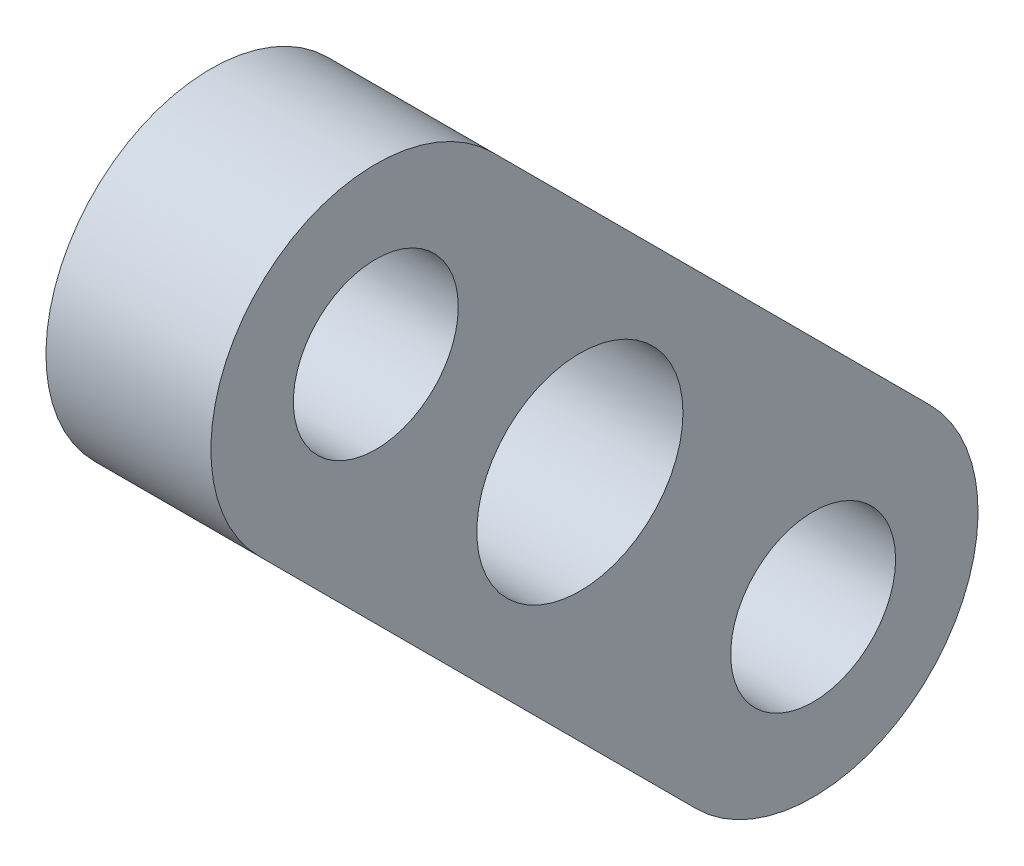
ISO-10303-21;
HEADER;
FILE_DESCRIPTION(('STEP AP214'),'2;1');
FILE_NAME('part.step','',(''),(''),'','','');
FILE_SCHEMA(('AUTOMOTIVE_DESIGN { 1 0 10303 214 1 1 1 1 }'));
ENDSEC;
DATA;
#1=APPLICATION_CONTEXT('core data for automotive mechanical design processes');
#2=APPLICATION_PROTOCOL_DEFINITION('international standard','automotive_design',2000,#1);
#3=PRODUCT_CONTEXT('',#1,'mechanical');
#4=PRODUCT('Part','Part','',(#3));
#5=PRODUCT_RELATED_PRODUCT_CATEGORY('part','',(#4));
#6=PRODUCT_DEFINITION_FORMATION('','',#4);
#7=PRODUCT_DEFINITION_CONTEXT('part definition',#1,'design');
#8=PRODUCT_DEFINITION('design','',#6,#7);
#9=PRODUCT_DEFINITION_SHAPE('','',#8);
#10=(LENGTH_UNIT() NAMED_UNIT(*) SI_UNIT(.MILLI.,.METRE.));
#11=(NAMED_UNIT(*) PLANE_ANGLE_UNIT() SI_UNIT($,.RADIAN.));
#12=(NAMED_UNIT(*) SI_UNIT($,.STERADIAN.) SOLID_ANGLE_UNIT());
#13=UNCERTAINTY_MEASURE_WITH_UNIT(LENGTH_MEASURE(1.E-05),#10,'distance_accuracy_value','');
#14=(GEOMETRIC_REPRESENTATION_CONTEXT(3) GLOBAL_UNCERTAINTY_ASSIGNED_CONTEXT((#13)) GLOBAL_UNIT_ASSIGNED_CONTEXT((#10,
#11,#12)) REPRESENTATION_CONTEXT('',''));
#15=CARTESIAN_POINT('',(0.,0.,0.));
#16=DIRECTION('',(0.,0.,1.));
#17=DIRECTION('',(1.,0.,0.));
#18=AXIS2_PLACEMENT_3D('',#15,#16,#17);
#19=CARTESIAN_POINT('',(2.,-1.41421356237309,1.4142135623731));
#20=DIRECTION('',(0.,0.707106781186544,-0.707106781186551));
#21=DIRECTION('',(0.,0.707106781186551,0.707106781186544));
#22=AXIS2_PLACEMENT_3D('',#19,#20,#21);
#23=PLANE('',#22);
#24=DIRECTION('',(0.,-0.707106781186551,-0.707106781186544));
#25=VECTOR('',#24,1.);
#26=CARTESIAN_POINT('',(0.,-1.41421356237309,1.4142135623731));
#27=LINE('',#26,#25);
#28=CARTESIAN_POINT('',(0.,1.06066017177984,3.88908729652601));
#29=VERTEX_POINT('',#28);
#30=CARTESIAN_POINT('',(0.,-4.24264068711929,-1.41421356237307));
#31=VERTEX_POINT('',#30);
#32=EDGE_CURVE('E113',#29,#31,#27,.T.);
#33=ORIENTED_EDGE('',*,*,#32,.T.);
#34=DIRECTION('',(-1.,0.,0.));
#35=VECTOR('',#34,1.);
#36=CARTESIAN_POINT('',(2.,-4.24264068711929,-1.41421356237307));
#37=LINE('',#36,#35);
#38=CARTESIAN_POINT('',(2.,-4.24264068711929,-1.41421356237307));
#39=VERTEX_POINT('',#38);
#40=EDGE_CURVE('E11',#39,#31,#37,.T.);
#41=ORIENTED_EDGE('',*,*,#40,.F.);
#42=DIRECTION('',(0.,-0.707106781186551,-0.707106781186544));
#43=VECTOR('',#42,1.);
#44=CARTESIAN_POINT('',(2.,-1.41421356237309,1.4142135623731));
#45=LINE('',#44,#43);
#46=CARTESIAN_POINT('',(2.,1.06066017177984,3.88908729652601));
#47=VERTEX_POINT('',#46);
#48=EDGE_CURVE('E89',#47,#39,#45,.T.);
#49=ORIENTED_EDGE('',*,*,#48,.F.);
#50=DIRECTION('',(-1.,0.,0.));
#51=VECTOR('',#50,1.);
#52=CARTESIAN_POINT('',(2.,1.06066017177984,3.88908729652601));
#53=LINE('',#52,#51);
#54=EDGE_CURVE('E112',#47,#29,#53,.T.);
#55=ORIENTED_EDGE('',*,*,#54,.T.);
#56=EDGE_LOOP('',(#33,#41,#49,#55));
#57=FACE_BOUND('',#56,.T.);
#58=ADVANCED_FACE('F41',(#57),#23,.F.);
#59=CARTESIAN_POINT('',(2.,-2.8284271247462,-2.82842712474617));
#60=DIRECTION('',(-1.,0.,0.));
#61=DIRECTION('',(0.,0.,1.));
#62=AXIS2_PLACEMENT_3D('',#59,#60,#61);
#63=CYLINDRICAL_SURFACE('',#62,2.);
#64=CARTESIAN_POINT('',(0.,-2.8284271247462,-2.82842712474617));
#65=DIRECTION('',(1.,0.,0.));
#66=DIRECTION('',(0.,0.,-1.));
#67=AXIS2_PLACEMENT_3D('',#64,#65,#66);
#68=CIRCLE('',#67,2.);
#69=CARTESIAN_POINT('',(0.,-1.41421356237312,-4.24264068711928));
#70=VERTEX_POINT('',#69);
#71=EDGE_CURVE('E94',#31,#70,#68,.T.);
#72=ORIENTED_EDGE('',*,*,#71,.T.);
#73=DIRECTION('',(-1.,0.,0.));
#74=VECTOR('',#73,1.);
#75=CARTESIAN_POINT('',(2.,-1.41421356237312,-4.24264068711928));
#76=LINE('',#75,#74);
#77=CARTESIAN_POINT('',(2.,-1.41421356237312,-4.24264068711928));
#78=VERTEX_POINT('',#77);
#79=EDGE_CURVE('E49',#78,#70,#76,.T.);
#80=ORIENTED_EDGE('',*,*,#79,.F.);
#81=CARTESIAN_POINT('',(2.,-2.8284271247462,-2.82842712474617));
#82=DIRECTION('',(1.,0.,0.));
#83=DIRECTION('',(0.,0.,-1.));
#84=AXIS2_PLACEMENT_3D('',#81,#82,#83);
#85=CIRCLE('',#84,2.);
#86=EDGE_CURVE('E83',#39,#78,#85,.T.);
#87=ORIENTED_EDGE('',*,*,#86,.F.);
#88=ORIENTED_EDGE('',*,*,#40,.T.);
#89=EDGE_LOOP('',(#72,#80,#87,#88));
#90=FACE_BOUND('',#89,.T.);
#91=ADVANCED_FACE('F93',(#90),#63,.T.);
#92=CARTESIAN_POINT('',(2.,1.41421356237309,-1.4142135623731));
#93=DIRECTION('',(0.,0.707106781186544,-0.707106781186551));
#94=DIRECTION('',(0.,0.707106781186551,0.707106781186544));
#95=AXIS2_PLACEMENT_3D('',#92,#93,#94);
#96=PLANE('',#95);
#97=DIRECTION('',(0.,-0.707106781186551,-0.707106781186544));
#98=VECTOR('',#97,1.);
#99=CARTESIAN_POINT('',(0.,1.41421356237309,-1.4142135623731));
#100=LINE('',#99,#98);
#101=CARTESIAN_POINT('',(0.,3.88908729652602,1.0606601717798));
#102=VERTEX_POINT('',#101);
#103=EDGE_CURVE('E117',#102,#70,#100,.T.);
#104=ORIENTED_EDGE('',*,*,#103,.F.);
#105=DIRECTION('',(-1.,0.,0.));
#106=VECTOR('',#105,1.);
#107=CARTESIAN_POINT('',(2.,3.88908729652602,1.0606601717798));
#108=LINE('',#107,#106);
#109=CARTESIAN_POINT('',(2.,3.88908729652602,1.0606601717798));
#110=VERTEX_POINT('',#109);
#111=EDGE_CURVE('E73',#110,#102,#108,.T.);
#112=ORIENTED_EDGE('',*,*,#111,.F.);
#113=DIRECTION('',(0.,-0.707106781186551,-0.707106781186544));
#114=VECTOR('',#113,1.);
#115=CARTESIAN_POINT('',(2.,1.41421356237309,-1.4142135623731));
#116=LINE('',#115,#114);
#117=EDGE_CURVE('E87',#110,#78,#116,.T.);
#118=ORIENTED_EDGE('',*,*,#117,.T.);
#119=ORIENTED_EDGE('',*,*,#79,.T.);
#120=EDGE_LOOP('',(#104,#112,#118,#119));
#121=FACE_BOUND('',#120,.T.);
#122=ADVANCED_FACE('F98',(#121),#96,.T.);
#123=CARTESIAN_POINT('',(2.,2.47487373415293,2.4748737341529));
#124=DIRECTION('',(-1.,0.,0.));
#125=DIRECTION('',(0.,0.,1.));
#126=AXIS2_PLACEMENT_3D('',#123,#124,#125);
#127=CYLINDRICAL_SURFACE('',#126,1.);
#128=CARTESIAN_POINT('',(2.,2.47487373415293,2.4748737341529));
#129=DIRECTION('',(1.,0.,0.));
#130=DIRECTION('',(0.,0.,-1.));
#131=AXIS2_PLACEMENT_3D('',#128,#129,#130);
#132=CIRCLE('',#131,1.);
#133=CARTESIAN_POINT('',(2.,2.47487373415293,1.4748737341529));
#134=VERTEX_POINT('',#133);
#135=EDGE_CURVE('E106',#134,#134,#132,.T.);
#136=ORIENTED_EDGE('',*,*,#135,.T.);
#137=EDGE_LOOP('',(#136));
#138=FACE_BOUND('',#137,.T.);
#139=CARTESIAN_POINT('',(0.,2.47487373415293,2.4748737341529));
#140=DIRECTION('',(1.,0.,0.));
#141=DIRECTION('',(0.,0.,-1.));
#142=AXIS2_PLACEMENT_3D('',#139,#140,#141);
#143=CIRCLE('',#142,1.);
#144=CARTESIAN_POINT('',(0.,2.47487373415293,1.4748737341529));
#145=VERTEX_POINT('',#144);
#146=EDGE_CURVE('E123',#145,#145,#143,.T.);
#147=ORIENTED_EDGE('',*,*,#146,.F.);
#148=EDGE_LOOP('',(#147));
#149=FACE_BOUND('',#148,.T.);
#150=ADVANCED_FACE('F163',(#138,#149),#127,.F.);
#151=CARTESIAN_POINT('',(2.,0.,0.));
#152=DIRECTION('',(-1.,0.,0.));
#153=DIRECTION('',(0.,0.,1.));
#154=AXIS2_PLACEMENT_3D('',#151,#152,#153);
#155=CYLINDRICAL_SURFACE('',#154,1.25);
#156=CARTESIAN_POINT('',(2.,0.,0.));
#157=DIRECTION('',(1.,0.,0.));
#158=DIRECTION('',(0.,0.,-1.));
#159=AXIS2_PLACEMENT_3D('',#156,#157,#158);
#160=CIRCLE('',#159,1.25);
#161=CARTESIAN_POINT('',(2.,0.,-1.25));
#162=VERTEX_POINT('',#161);
#163=EDGE_CURVE('E100',#162,#162,#160,.T.);
#164=ORIENTED_EDGE('',*,*,#163,.T.);
#165=EDGE_LOOP('',(#164));
#166=FACE_BOUND('',#165,.T.);
#167=CARTESIAN_POINT('',(0.,0.,0.));
#168=DIRECTION('',(1.,0.,0.));
#169=DIRECTION('',(0.,0.,-1.));
#170=AXIS2_PLACEMENT_3D('',#167,#168,#169);
#171=CIRCLE('',#170,1.25);
#172=CARTESIAN_POINT('',(0.,0.,-1.25));
#173=VERTEX_POINT('',#172);
#174=EDGE_CURVE('E120',#173,#173,#171,.T.);
#175=ORIENTED_EDGE('',*,*,#174,.F.);
#176=EDGE_LOOP('',(#175));
#177=FACE_BOUND('',#176,.T.);
#178=ADVANCED_FACE('F153',(#166,#177),#155,.F.);
#179=CARTESIAN_POINT('',(2.,2.47487373415293,2.4748737341529));
#180=DIRECTION('',(-1.,0.,0.));
#181=DIRECTION('',(0.,0.,1.));
#182=AXIS2_PLACEMENT_3D('',#179,#180,#181);
#183=CYLINDRICAL_SURFACE('',#182,2.);
#184=CARTESIAN_POINT('',(0.,2.47487373415293,2.4748737341529));
#185=DIRECTION('',(1.,0.,0.));
#186=DIRECTION('',(0.,0.,-1.));
#187=AXIS2_PLACEMENT_3D('',#184,#185,#186);
#188=CIRCLE('',#187,2.);
#189=EDGE_CURVE('E76',#102,#29,#188,.T.);
#190=ORIENTED_EDGE('',*,*,#189,.T.);
#191=ORIENTED_EDGE('',*,*,#54,.F.);
#192=CARTESIAN_POINT('',(2.,2.47487373415293,2.4748737341529));
#193=DIRECTION('',(1.,0.,0.));
#194=DIRECTION('',(0.,0.,-1.));
#195=AXIS2_PLACEMENT_3D('',#192,#193,#194);
#196=CIRCLE('',#195,2.);
#197=EDGE_CURVE('E57',#110,#47,#196,.T.);
#198=ORIENTED_EDGE('',*,*,#197,.F.);
#199=ORIENTED_EDGE('',*,*,#111,.T.);
#200=EDGE_LOOP('',(#190,#191,#198,#199));
#201=FACE_BOUND('',#200,.T.);
#202=ADVANCED_FACE('F145',(#201),#183,.T.);
#203=CARTESIAN_POINT('',(2.,-2.8284271247462,-2.82842712474617));
#204=DIRECTION('',(-1.,0.,0.));
#205=DIRECTION('',(0.,0.,1.));
#206=AXIS2_PLACEMENT_3D('',#203,#204,#205);
#207=CYLINDRICAL_SURFACE('',#206,1.);
#208=CARTESIAN_POINT('',(2.,-2.8284271247462,-2.82842712474617));
#209=DIRECTION('',(1.,0.,0.));
#210=DIRECTION('',(0.,0.,-1.));
#211=AXIS2_PLACEMENT_3D('',#208,#209,#210);
#212=CIRCLE('',#211,1.);
#213=CARTESIAN_POINT('',(2.,-2.8284271247462,-3.82842712474617));
#214=VERTEX_POINT('',#213);
#215=EDGE_CURVE('E109',#214,#214,#212,.T.);
#216=ORIENTED_EDGE('',*,*,#215,.T.);
#217=EDGE_LOOP('',(#216));
#218=FACE_BOUND('',#217,.T.);
#219=CARTESIAN_POINT('',(0.,-2.8284271247462,-2.82842712474617));
#220=DIRECTION('',(1.,0.,0.));
#221=DIRECTION('',(0.,0.,-1.));
#222=AXIS2_PLACEMENT_3D('',#219,#220,#221);
#223=CIRCLE('',#222,1.);
#224=CARTESIAN_POINT('',(0.,-2.8284271247462,-3.82842712474617));
#225=VERTEX_POINT('',#224);
#226=EDGE_CURVE('E126',#225,#225,#223,.T.);
#227=ORIENTED_EDGE('',*,*,#226,.F.);
#228=EDGE_LOOP('',(#227));
#229=FACE_BOUND('',#228,.T.);
#230=ADVANCED_FACE('F143',(#218,#229),#207,.F.);
#231=CARTESIAN_POINT('',(2.,0.,0.));
#232=DIRECTION('',(1.,0.,0.));
#233=DIRECTION('',(0.,0.,-1.));
#234=AXIS2_PLACEMENT_3D('',#231,#232,#233);
#235=PLANE('',#234);
#236=ORIENTED_EDGE('',*,*,#48,.T.);
#237=ORIENTED_EDGE('',*,*,#86,.T.);
#238=ORIENTED_EDGE('',*,*,#117,.F.);
#239=ORIENTED_EDGE('',*,*,#197,.T.);
#240=EDGE_LOOP('',(#236,#237,#238,#239));
#241=FACE_BOUND('',#240,.T.);
#242=ORIENTED_EDGE('',*,*,#163,.F.);
#243=EDGE_LOOP('',(#242));
#244=FACE_BOUND('',#243,.T.);
#245=ORIENTED_EDGE('',*,*,#135,.F.);
#246=EDGE_LOOP('',(#245));
#247=FACE_BOUND('',#246,.T.);
#248=ORIENTED_EDGE('',*,*,#215,.F.);
#249=EDGE_LOOP('',(#248));
#250=FACE_BOUND('',#249,.T.);
#251=ADVANCED_FACE('F84',(#241,#244,#247,#250),#235,.T.);
#252=CARTESIAN_POINT('',(0.,0.,0.));
#253=DIRECTION('',(1.,0.,0.));
#254=DIRECTION('',(0.,0.,-1.));
#255=AXIS2_PLACEMENT_3D('',#252,#253,#254);
#256=PLANE('',#255);
#257=ORIENTED_EDGE('',*,*,#32,.F.);
#258=ORIENTED_EDGE('',*,*,#189,.F.);
#259=ORIENTED_EDGE('',*,*,#103,.T.);
#260=ORIENTED_EDGE('',*,*,#71,.F.);
#261=EDGE_LOOP('',(#257,#258,#259,#260));
#262=FACE_BOUND('',#261,.T.);
#263=ORIENTED_EDGE('',*,*,#174,.T.);
#264=EDGE_LOOP('',(#263));
#265=FACE_BOUND('',#264,.T.);
#266=ORIENTED_EDGE('',*,*,#146,.T.);
#267=EDGE_LOOP('',(#266));
#268=FACE_BOUND('',#267,.T.);
#269=ORIENTED_EDGE('',*,*,#226,.T.);
#270=EDGE_LOOP('',(#269));
#271=FACE_BOUND('',#270,.T.);
#272=ADVANCED_FACE('F133',(#262,#265,#268,#271),#256,.F.);
#273=CLOSED_SHELL('',(#58,#91,#122,#150,#178,#202,#230,#251,#272));
#274=MANIFOLD_SOLID_BREP('B2',#273);
#275=ADVANCED_BREP_SHAPE_REPRESENTATION('',(#18,#274),#14);
#276=SHAPE_DEFINITION_REPRESENTATION(#9,#275);
ENDSEC;
END-ISO-10303-21;
